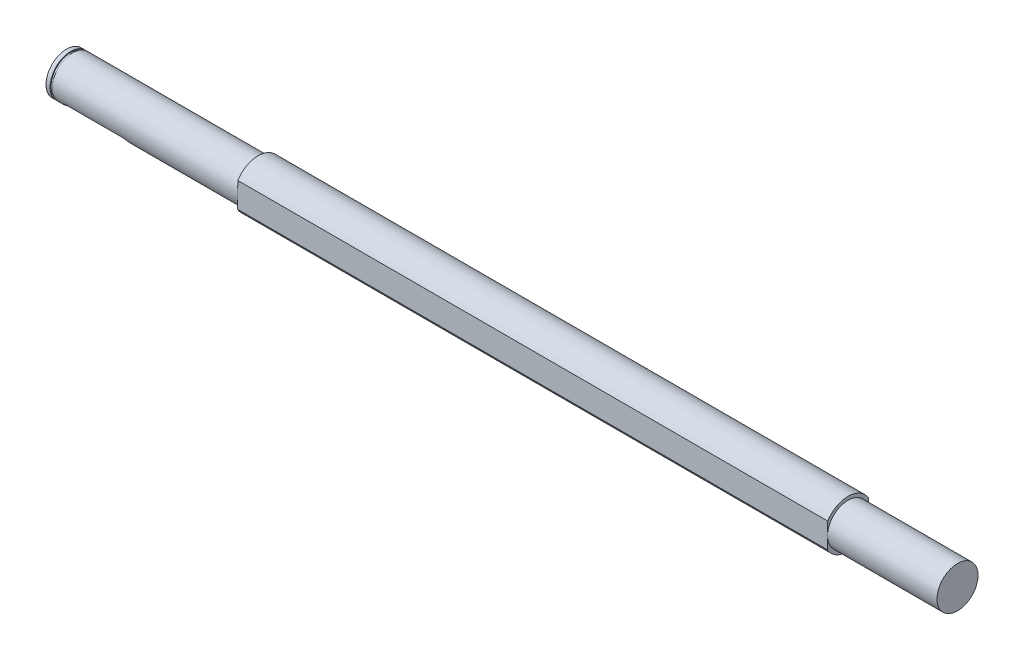
ISO-10303-21;
HEADER;
FILE_DESCRIPTION(('STEP AP214'),'2;1');
FILE_NAME('part.step','',(''),(''),'','','');
FILE_SCHEMA(('AUTOMOTIVE_DESIGN { 1 0 10303 214 1 1 1 1 }'));
ENDSEC;
DATA;
#1=APPLICATION_CONTEXT('core data for automotive mechanical design processes');
#2=APPLICATION_PROTOCOL_DEFINITION('international standard','automotive_design',2000,#1);
#3=PRODUCT_CONTEXT('',#1,'mechanical');
#4=PRODUCT('Part','Part','',(#3));
#5=PRODUCT_RELATED_PRODUCT_CATEGORY('part','',(#4));
#6=PRODUCT_DEFINITION_FORMATION('','',#4);
#7=PRODUCT_DEFINITION_CONTEXT('part definition',#1,'design');
#8=PRODUCT_DEFINITION('design','',#6,#7);
#9=PRODUCT_DEFINITION_SHAPE('','',#8);
#10=(LENGTH_UNIT() NAMED_UNIT(*) SI_UNIT(.MILLI.,.METRE.));
#11=(NAMED_UNIT(*) PLANE_ANGLE_UNIT() SI_UNIT($,.RADIAN.));
#12=(NAMED_UNIT(*) SI_UNIT($,.STERADIAN.) SOLID_ANGLE_UNIT());
#13=UNCERTAINTY_MEASURE_WITH_UNIT(LENGTH_MEASURE(1.E-05),#10,'distance_accuracy_value','');
#14=(GEOMETRIC_REPRESENTATION_CONTEXT(3) GLOBAL_UNCERTAINTY_ASSIGNED_CONTEXT((#13)) GLOBAL_UNIT_ASSIGNED_CONTEXT((#10,
#11,#12)) REPRESENTATION_CONTEXT('',''));
#15=CARTESIAN_POINT('',(0.,0.,0.));
#16=DIRECTION('',(0.,0.,1.));
#17=DIRECTION('',(1.,0.,0.));
#18=AXIS2_PLACEMENT_3D('',#15,#16,#17);
#19=CARTESIAN_POINT('',(-325.5,0.,0.));
#20=DIRECTION('',(-1.,0.,0.));
#21=DIRECTION('',(0.,0.,1.));
#22=AXIS2_PLACEMENT_3D('',#19,#20,#21);
#23=CYLINDRICAL_SURFACE('',#22,15.);
#24=CARTESIAN_POINT('',(-185.5,0.,0.));
#25=DIRECTION('',(-1.,0.,0.));
#26=DIRECTION('',(0.,0.,1.));
#27=AXIS2_PLACEMENT_3D('',#24,#25,#26);
#28=CIRCLE('',#27,15.);
#29=CARTESIAN_POINT('',(-185.5,0.25612963538557,14.997813094244));
#30=VERTEX_POINT('',#29);
#31=CARTESIAN_POINT('',(-185.5,0.25612963538557,-14.997813094244));
#32=VERTEX_POINT('',#31);
#33=EDGE_CURVE('E210',#30,#32,#28,.T.);
#34=ORIENTED_EDGE('',*,*,#33,.T.);
#35=EDGE_CURVE('E209',#32,#30,#28,.T.);
#36=ORIENTED_EDGE('',*,*,#35,.T.);
#37=EDGE_LOOP('',(#34,#36));
#38=FACE_BOUND('',#37,.T.);
#39=CARTESIAN_POINT('',(-320.9,0.,0.));
#40=DIRECTION('',(-1.,0.,0.));
#41=DIRECTION('',(0.,0.,1.));
#42=AXIS2_PLACEMENT_3D('',#39,#40,#41);
#43=CIRCLE('',#42,15.);
#44=CARTESIAN_POINT('',(-320.9,0.,15.));
#45=VERTEX_POINT('',#44);
#46=EDGE_CURVE('E139',#45,#45,#43,.T.);
#47=ORIENTED_EDGE('',*,*,#46,.F.);
#48=EDGE_LOOP('',(#47));
#49=FACE_BOUND('',#48,.T.);
#50=CARTESIAN_POINT('',(-272.5,-14.0474424568268,5.26016733784588));
#51=CARTESIAN_POINT('',(-272.363588172093,-14.0474377349199,5.26013820389123));
#52=CARTESIAN_POINT('',(-272.227185014359,-14.0453660462012,5.26571129083079));
#53=CARTESIAN_POINT('',(-271.955436759906,-14.0370558721608,5.28784636697262));
#54=CARTESIAN_POINT('',(-271.820091387547,-14.0308185116335,5.30440538979805));
#55=CARTESIAN_POINT('',(-271.551821342899,-14.0141687815497,5.34823221447327));
#56=CARTESIAN_POINT('',(-271.418890703097,-14.0037687936958,5.37546825272411));
#57=CARTESIAN_POINT('',(-271.155975354342,-13.9787292102991,5.4402520410106));
#58=CARTESIAN_POINT('',(-271.025990752042,-13.9640894615321,5.47780016372079));
#59=CARTESIAN_POINT('',(-270.76994100167,-13.9304965618603,5.56267403769161));
#60=CARTESIAN_POINT('',(-270.643872780107,-13.9115468957287,5.60999188682916));
#61=CARTESIAN_POINT('',(-270.39633145206,-13.869225116675,5.71381959138956));
#62=CARTESIAN_POINT('',(-270.274860080898,-13.84585135324,5.77033287627661));
#63=CARTESIAN_POINT('',(-269.918431071587,-13.7688967304051,5.95272426476689));
#64=CARTESIAN_POINT('',(-269.691349816361,-13.7084686528966,6.091490559605));
#65=CARTESIAN_POINT('',(-269.256362129662,-13.5659539007254,6.40274426922543));
#66=CARTESIAN_POINT('',(-269.049415751017,-13.4831778687844,6.57624927228739));
#67=CARTESIAN_POINT('',(-268.668979759463,-13.296036403093,6.94683036989116));
#68=CARTESIAN_POINT('',(-268.495496104132,-13.1916671318056,7.14391065158707));
#69=CARTESIAN_POINT('',(-268.182599665868,-12.9579049621404,7.55982738951223));
#70=CARTESIAN_POINT('',(-268.044194343739,-12.8279300298558,7.77909743740974));
#71=CARTESIAN_POINT('',(-267.812039475589,-12.5455840671215,8.22667597346589));
#72=CARTESIAN_POINT('',(-267.718276288113,-12.3932198968773,8.45498167744052));
#73=CARTESIAN_POINT('',(-267.581321179188,-12.0742625012808,8.90423492792477));
#74=CARTESIAN_POINT('',(-267.536483572902,-11.9083486029548,9.12516217571773));
#75=CARTESIAN_POINT('',(-267.493418571686,-11.5620760934703,9.56010380061229));
#76=CARTESIAN_POINT('',(-267.495180070612,-11.3817209343688,9.77411981272089));
#77=CARTESIAN_POINT('',(-267.544221351199,-11.0194803977554,10.1804859272811));
#78=CARTESIAN_POINT('',(-267.589712996873,-10.8379325276971,10.3733565867825));
#79=CARTESIAN_POINT('',(-267.721966186305,-10.4726172598045,10.7420517153407));
#80=CARTESIAN_POINT('',(-267.80873001845,-10.2888497394498,10.9178752385473));
#81=CARTESIAN_POINT('',(-268.02210613128,-9.92300286729053,11.2514961156681));
#82=CARTESIAN_POINT('',(-268.149227537907,-9.74097751366739,11.4090259478938));
#83=CARTESIAN_POINT('',(-268.43930244539,-9.3876237552169,11.701504412838));
#84=CARTESIAN_POINT('',(-268.602265693331,-9.21629827649319,11.836446885377));
#85=CARTESIAN_POINT('',(-268.96834474013,-8.88313323701207,12.0886586503445));
#86=CARTESIAN_POINT('',(-269.172987637847,-8.72211788456879,12.2047993195582));
#87=CARTESIAN_POINT('',(-269.612247541709,-8.425949041208,12.4111264371431));
#88=CARTESIAN_POINT('',(-269.846874193754,-8.29080390795374,12.5013045027313));
#89=CARTESIAN_POINT('',(-270.218391187969,-8.11189386195861,12.6175405672568));
#90=CARTESIAN_POINT('',(-270.346569255959,-8.05588486247114,12.65331605966));
#91=CARTESIAN_POINT('',(-270.608206226196,-7.95312629561886,12.7181553549193));
#92=CARTESIAN_POINT('',(-270.741662902595,-7.90637287432661,12.7472219521302));
#93=CARTESIAN_POINT('',(-271.012771358208,-7.82290422599136,12.7986161020993));
#94=CARTESIAN_POINT('',(-271.15041839138,-7.78617808004157,12.8209509879339));
#95=CARTESIAN_POINT('',(-271.428960193059,-7.72331750797088,12.8589155735559));
#96=CARTESIAN_POINT('',(-271.569853447452,-7.69717824550017,12.8745483352306));
#97=CARTESIAN_POINT('',(-271.842053058188,-7.65764861355719,12.8980978502647));
#98=CARTESIAN_POINT('',(-271.973186899473,-7.64338161661688,12.9065464508502));
#99=CARTESIAN_POINT('',(-272.236210415875,-7.6243341389232,12.9177997339071));
#100=CARTESIAN_POINT('',(-272.368098894585,-7.61954141701345,12.9206116992111));
#101=CARTESIAN_POINT('',(-272.5,-7.6195663599614,12.9206117690357));
#102=B_SPLINE_CURVE_WITH_KNOTS('',3,(#50,#51,#52,#53,#54,#55,#56,#57,#58,#59,#60,#61,#62,#63,
#64,#65,#66,#67,#68,#69,#70,#71,#72,#73,#74,#75,#76,#77,#78,#79,#80,#81,#82,#83,#84,#85,#86,#87,
#88,#89,#90,#91,#92,#93,#94,#95,#96,#97,#98,#99,#100,#101),.UNSPECIFIED.,.F.,.F.,(4,2,2,2,2,2,2,
2,2,2,2,2,2,2,2,2,2,2,2,2,2,2,2,2,2,4),(0.,0.409092423677147,0.818074430847269,1.22584885885817,
1.6336380256108,2.04109864022588,2.44871156823781,3.26359482908315,4.1072485115405,
4.95105225659396,5.81687991006165,6.68244281946299,7.51789679977676,8.35315166493873,
9.15564418669337,9.958181208819,10.771274204705,11.5845885928451,12.4361259663091,
13.2879379758687,13.7206337000479,14.1531488734623,14.5851911765747,15.0170358888757,
15.4131122811713,15.8086765909866),.UNSPECIFIED.);
#103=CARTESIAN_POINT('',(-272.5,-14.0474424568268,5.26016733784588));
#104=VERTEX_POINT('',#103);
#105=CARTESIAN_POINT('',(-272.5,-7.6195663599614,12.9206117690357));
#106=VERTEX_POINT('',#105);
#107=EDGE_CURVE('E218',#104,#106,#102,.T.);
#108=ORIENTED_EDGE('',*,*,#107,.F.);
#109=DIRECTION('',(-1.,0.,0.));
#110=VECTOR('',#109,1.);
#111=CARTESIAN_POINT('',(-325.5,-14.0474424568268,5.2601673378459));
#112=LINE('',#111,#110);
#113=CARTESIAN_POINT('',(-312.5,-14.0474424568268,5.26016733784589));
#114=VERTEX_POINT('',#113);
#115=EDGE_CURVE('E11',#114,#104,#112,.F.);
#116=ORIENTED_EDGE('',*,*,#115,.F.);
#117=CARTESIAN_POINT('',(-312.5,-7.6195663599614,12.9206117690357));
#118=CARTESIAN_POINT('',(-312.636411827907,-7.61953684866646,12.9206121779233));
#119=CARTESIAN_POINT('',(-312.772814985641,-7.62466552292207,12.9176042064203));
#120=CARTESIAN_POINT('',(-313.044563240094,-7.64502127094185,12.9055765669619));
#121=CARTESIAN_POINT('',(-313.179908612453,-7.66024561871361,12.8965585218187));
#122=CARTESIAN_POINT('',(-313.448178657101,-7.70051542015599,12.8725512903088));
#123=CARTESIAN_POINT('',(-313.581109296903,-7.72553174284816,12.8575798132299));
#124=CARTESIAN_POINT('',(-313.844024645658,-7.78498324179583,12.8216710505904));
#125=CARTESIAN_POINT('',(-313.974009247958,-7.81941875845698,12.8007335494191));
#126=CARTESIAN_POINT('',(-314.23005899833,-7.89716986176105,12.7529128078295));
#127=CARTESIAN_POINT('',(-314.356127219893,-7.94047827145643,12.7260343714323));
#128=CARTESIAN_POINT('',(-314.60366854794,-8.03537950007666,12.6663260636107));
#129=CARTESIAN_POINT('',(-314.725139919102,-8.0869754097559,12.6334939712282));
#130=CARTESIAN_POINT('',(-315.081568928413,-8.25323283320547,12.5260365297968));
#131=CARTESIAN_POINT('',(-315.308650183639,-8.37939773067957,12.4424299763466));
#132=CARTESIAN_POINT('',(-315.743637870338,-8.6611753700624,12.2480317040221));
#133=CARTESIAN_POINT('',(-315.950584248983,-8.81767053516315,12.1363843984052));
#134=CARTESIAN_POINT('',(-316.331020240537,-9.15012489871988,11.8877352998056));
#135=CARTESIAN_POINT('',(-316.504503895868,-9.32608755433637,11.7507290004949));
#136=CARTESIAN_POINT('',(-316.817400334132,-9.69509320768278,11.4482950198457));
#137=CARTESIAN_POINT('',(-316.955805656261,-9.88846214072199,11.2822188546003));
#138=CARTESIAN_POINT('',(-317.187960524411,-10.2802120912115,10.9264411643189));
#139=CARTESIAN_POINT('',(-317.281723711887,-10.478591558038,10.736746878735));
#140=CARTESIAN_POINT('',(-317.418678820812,-10.8656332716821,10.3446231544134));
#141=CARTESIAN_POINT('',(-317.463516427098,-11.0543934920663,10.1428662470333));
#142=CARTESIAN_POINT('',(-317.506581428314,-11.4225977861221,9.72632757448353));
#143=CARTESIAN_POINT('',(-317.504819929388,-11.6020440694046,9.51154892501044));
#144=CARTESIAN_POINT('',(-317.455778648801,-11.939334160525,9.08424690083927));
#145=CARTESIAN_POINT('',(-317.410287003127,-12.0977492245355,8.87196551231514));
#146=CARTESIAN_POINT('',(-317.278033813695,-12.397406715094,8.44817696701201));
#147=CARTESIAN_POINT('',(-317.19126998155,-12.5386481888858,8.23666985381901));
#148=CARTESIAN_POINT('',(-316.97789386872,-12.8036719725855,7.81844836035763));
#149=CARTESIAN_POINT('',(-316.850772462093,-12.9272002017463,7.61183361257059));
#150=CARTESIAN_POINT('',(-316.56069755461,-13.1538760253857,7.21305973924815));
#151=CARTESIAN_POINT('',(-316.397734306669,-13.2570180613845,7.02090456506627));
#152=CARTESIAN_POINT('',(-316.03165525987,-13.4475446609571,6.64900493777987));
#153=CARTESIAN_POINT('',(-315.827012362153,-13.5339608699106,6.47026815477774));
#154=CARTESIAN_POINT('',(-315.387752458291,-13.6857242350336,6.14277045366348));
#155=CARTESIAN_POINT('',(-315.153125806246,-13.7510645870663,5.99401922189791));
#156=CARTESIAN_POINT('',(-314.781608812031,-13.8344673611373,5.79764304072611));
#157=CARTESIAN_POINT('',(-314.653430744041,-13.8599734827298,5.73627259473143));
#158=CARTESIAN_POINT('',(-314.391793773804,-13.9059838855275,5.62381593594389));
#159=CARTESIAN_POINT('',(-314.258337097405,-13.9264902494074,5.57272544253877));
#160=CARTESIAN_POINT('',(-313.987228641792,-13.9626094280807,5.4816003700399));
#161=CARTESIAN_POINT('',(-313.84958160862,-13.9782275684963,5.44155376454674));
#162=CARTESIAN_POINT('',(-313.571039806941,-14.0046997629696,5.3730557047036));
#163=CARTESIAN_POINT('',(-313.430146552548,-14.0155559925742,5.34459895578771));
#164=CARTESIAN_POINT('',(-313.157946941812,-14.0318834890087,5.30158053740594));
#165=CARTESIAN_POINT('',(-313.026813100527,-14.037726298348,5.28606320411141));
#166=CARTESIAN_POINT('',(-312.763789584125,-14.0455010589586,5.26535098830773));
#167=CARTESIAN_POINT('',(-312.631901105415,-14.0474380567655,5.26014278596228));
#168=CARTESIAN_POINT('',(-312.5,-14.0474424568268,5.26016733784589));
#169=B_SPLINE_CURVE_WITH_KNOTS('',3,(#117,#118,#119,#120,#121,#122,#123,#124,#125,#126,#127,
#128,#129,#130,#131,#132,#133,#134,#135,#136,#137,#138,#139,#140,#141,#142,#143,#144,#145,#146,
#147,#148,#149,#150,#151,#152,#153,#154,#155,#156,#157,#158,#159,#160,#161,#162,#163,#164,#165,
#166,#167,#168),.UNSPECIFIED.,.F.,.F.,(4,2,2,2,2,2,2,2,2,2,2,2,2,2,2,2,2,2,2,2,2,2,2,2,2,4),(0.,
0.409092423677147,0.818074430847326,1.22584885885817,1.6336380256108,2.04109864022582,
2.44871156823775,3.26359482908315,4.10724851154048,4.95105225659396,5.81687991006164,
6.68244281946293,7.51789679977672,8.35315166493871,9.15564418669334,9.95818120881898,
10.771274204705,11.584588592845,12.4361259663091,13.2879379758687,13.7206337000479,
14.1531488734624,14.5851911765746,15.0170358888757,15.4131122811712,15.8086765909866),.UNSPECIFIED.);
#170=CARTESIAN_POINT('',(-312.5,-7.6195663599614,12.9206117690357));
#171=VERTEX_POINT('',#170);
#172=EDGE_CURVE('E47',#171,#114,#169,.T.);
#173=ORIENTED_EDGE('',*,*,#172,.F.);
#174=DIRECTION('',(-1.,0.,0.));
#175=VECTOR('',#174,1.);
#176=CARTESIAN_POINT('',(-325.5,-7.6195663599614,12.9206117690357));
#177=LINE('',#176,#175);
#178=EDGE_CURVE('E137',#106,#171,#177,.T.);
#179=ORIENTED_EDGE('',*,*,#178,.F.);
#180=EDGE_LOOP('',(#108,#116,#173,#179));
#181=FACE_BOUND('',#180,.T.);
#182=ADVANCED_FACE('F38',(#38,#49,#181),#23,.T.);
#183=CARTESIAN_POINT('',(-185.5,15.,0.));
#184=DIRECTION('',(1.,0.,0.));
#185=DIRECTION('',(0.,0.,-1.));
#186=AXIS2_PLACEMENT_3D('',#183,#184,#185);
#187=PLANE('',#186);
#188=CARTESIAN_POINT('',(-185.5,0.,0.));
#189=DIRECTION('',(-1.,0.,0.));
#190=DIRECTION('',(0.,0.,1.));
#191=AXIS2_PLACEMENT_3D('',#188,#189,#190);
#192=CIRCLE('',#191,17.5);
#193=CARTESIAN_POINT('',(-185.5,9.26869365723926,14.8438983386526));
#194=VERTEX_POINT('',#193);
#195=CARTESIAN_POINT('',(-185.5,9.26869365723926,-14.8438983386526));
#196=VERTEX_POINT('',#195);
#197=EDGE_CURVE('E205',#194,#196,#192,.T.);
#198=ORIENTED_EDGE('',*,*,#197,.T.);
#199=DIRECTION('',(0.,0.999854206282934,0.0170753090257047));
#200=VECTOR('',#199,1.);
#201=CARTESIAN_POINT('',(-185.5,9.26869365723926,-14.8438983386526));
#202=LINE('',#201,#200);
#203=EDGE_CURVE('E167',#32,#196,#202,.T.);
#204=ORIENTED_EDGE('',*,*,#203,.F.);
#205=ORIENTED_EDGE('',*,*,#33,.F.);
#206=DIRECTION('',(0.,-0.999854206282934,0.0170753090257047));
#207=VECTOR('',#206,1.);
#208=CARTESIAN_POINT('',(-185.5,9.26869365723926,14.8438983386526));
#209=LINE('',#208,#207);
#210=EDGE_CURVE('E179',#194,#30,#209,.T.);
#211=ORIENTED_EDGE('',*,*,#210,.F.);
#212=EDGE_LOOP('',(#198,#204,#205,#211));
#213=FACE_BOUND('',#212,.T.);
#214=ADVANCED_FACE('F280',(#213),#187,.F.);
#215=CARTESIAN_POINT('',(-325.5,0.,0.));
#216=DIRECTION('',(-1.,0.,0.));
#217=DIRECTION('',(0.,0.,1.));
#218=AXIS2_PLACEMENT_3D('',#215,#216,#217);
#219=CYLINDRICAL_SURFACE('',#218,17.5);
#220=CARTESIAN_POINT('',(245.5,0.,0.));
#221=DIRECTION('',(-1.,0.,0.));
#222=DIRECTION('',(0.,0.,1.));
#223=AXIS2_PLACEMENT_3D('',#220,#221,#222);
#224=CIRCLE('',#223,17.5);
#225=CARTESIAN_POINT('',(245.5,9.26869365723933,14.8438983386526));
#226=VERTEX_POINT('',#225);
#227=CARTESIAN_POINT('',(245.5,9.26869365723927,-14.8438983386526));
#228=VERTEX_POINT('',#227);
#229=EDGE_CURVE('E200',#226,#228,#224,.T.);
#230=ORIENTED_EDGE('',*,*,#229,.T.);
#231=DIRECTION('',(-1.,0.,0.));
#232=VECTOR('',#231,1.);
#233=CARTESIAN_POINT('',(263.719772694176,9.26869365723933,-14.8438983386526));
#234=LINE('',#233,#232);
#235=EDGE_CURVE('E168',#228,#196,#234,.T.);
#236=ORIENTED_EDGE('',*,*,#235,.T.);
#237=ORIENTED_EDGE('',*,*,#197,.F.);
#238=DIRECTION('',(-1.,0.,0.));
#239=VECTOR('',#238,1.);
#240=CARTESIAN_POINT('',(263.719772694176,9.26869365723933,14.8438983386526));
#241=LINE('',#240,#239);
#242=EDGE_CURVE('E182',#226,#194,#241,.T.);
#243=ORIENTED_EDGE('',*,*,#242,.F.);
#244=EDGE_LOOP('',(#230,#236,#237,#243));
#245=FACE_BOUND('',#244,.T.);
#246=ADVANCED_FACE('F284',(#245),#219,.T.);
#247=CARTESIAN_POINT('',(245.5,17.5,0.));
#248=DIRECTION('',(-1.,0.,0.));
#249=DIRECTION('',(0.,0.,1.));
#250=AXIS2_PLACEMENT_3D('',#247,#248,#249);
#251=PLANE('',#250);
#252=CARTESIAN_POINT('',(245.5,-8.75643438646803,-15.1517278498354));
#253=VERTEX_POINT('',#252);
#254=CARTESIAN_POINT('',(245.5,-8.75643438646813,15.1517278498354));
#255=VERTEX_POINT('',#254);
#256=EDGE_CURVE('E199',#253,#255,#224,.T.);
#257=ORIENTED_EDGE('',*,*,#256,.F.);
#258=DIRECTION('',(0.,-0.999854206282935,-0.0170753090257047));
#259=VECTOR('',#258,1.);
#260=CARTESIAN_POINT('',(245.5,9.26869365723933,-14.8438983386526));
#261=LINE('',#260,#259);
#262=CARTESIAN_POINT('',(245.5,0.25612963538557,-14.997813094244));
#263=VERTEX_POINT('',#262);
#264=EDGE_CURVE('E172',#263,#253,#261,.T.);
#265=ORIENTED_EDGE('',*,*,#264,.F.);
#266=CARTESIAN_POINT('',(245.5,0.,0.));
#267=DIRECTION('',(-1.,0.,0.));
#268=DIRECTION('',(0.,0.,1.));
#269=AXIS2_PLACEMENT_3D('',#266,#267,#268);
#270=CIRCLE('',#269,15.);
#271=CARTESIAN_POINT('',(245.5,0.25612963538557,14.997813094244));
#272=VERTEX_POINT('',#271);
#273=EDGE_CURVE('E194',#263,#272,#270,.T.);
#274=ORIENTED_EDGE('',*,*,#273,.T.);
#275=DIRECTION('',(0.,0.999854206282935,-0.0170753090257047));
#276=VECTOR('',#275,1.);
#277=CARTESIAN_POINT('',(245.5,9.26869365723933,14.8438983386526));
#278=LINE('',#277,#276);
#279=EDGE_CURVE('E188',#255,#272,#278,.T.);
#280=ORIENTED_EDGE('',*,*,#279,.F.);
#281=EDGE_LOOP('',(#257,#265,#274,#280));
#282=FACE_BOUND('',#281,.T.);
#283=ADVANCED_FACE('F297',(#282),#251,.F.);
#284=ORIENTED_EDGE('',*,*,#35,.F.);
#285=CARTESIAN_POINT('',(-185.5,-8.75643438646803,-15.1517278498354));
#286=VERTEX_POINT('',#285);
#287=EDGE_CURVE('E163',#286,#32,#202,.T.);
#288=ORIENTED_EDGE('',*,*,#287,.F.);
#289=CARTESIAN_POINT('',(-185.5,-8.75643438646803,15.1517278498354));
#290=VERTEX_POINT('',#289);
#291=EDGE_CURVE('E204',#286,#290,#192,.T.);
#292=ORIENTED_EDGE('',*,*,#291,.T.);
#293=EDGE_CURVE('E162',#30,#290,#209,.T.);
#294=ORIENTED_EDGE('',*,*,#293,.F.);
#295=EDGE_LOOP('',(#284,#288,#292,#294));
#296=FACE_BOUND('',#295,.T.);
#297=ADVANCED_FACE('F274',(#296),#187,.F.);
#298=ORIENTED_EDGE('',*,*,#291,.F.);
#299=DIRECTION('',(-1.,0.,0.));
#300=VECTOR('',#299,1.);
#301=CARTESIAN_POINT('',(263.719772694176,-8.75643438646797,-15.1517278498354));
#302=LINE('',#301,#300);
#303=EDGE_CURVE('E166',#253,#286,#302,.T.);
#304=ORIENTED_EDGE('',*,*,#303,.F.);
#305=ORIENTED_EDGE('',*,*,#256,.T.);
#306=DIRECTION('',(-1.,0.,0.));
#307=VECTOR('',#306,1.);
#308=CARTESIAN_POINT('',(263.719772694176,-8.75643438646797,15.1517278498354));
#309=LINE('',#308,#307);
#310=EDGE_CURVE('E61',#255,#290,#309,.T.);
#311=ORIENTED_EDGE('',*,*,#310,.T.);
#312=EDGE_LOOP('',(#298,#304,#305,#311));
#313=FACE_BOUND('',#312,.T.);
#314=ADVANCED_FACE('F270',(#313),#219,.T.);
#315=EDGE_CURVE('E195',#272,#263,#270,.T.);
#316=ORIENTED_EDGE('',*,*,#315,.T.);
#317=EDGE_CURVE('E175',#228,#263,#261,.T.);
#318=ORIENTED_EDGE('',*,*,#317,.F.);
#319=ORIENTED_EDGE('',*,*,#229,.F.);
#320=EDGE_CURVE('E185',#272,#226,#278,.T.);
#321=ORIENTED_EDGE('',*,*,#320,.F.);
#322=EDGE_LOOP('',(#316,#318,#319,#321));
#323=FACE_BOUND('',#322,.T.);
#324=ADVANCED_FACE('F289',(#323),#251,.F.);
#325=CARTESIAN_POINT('',(-325.5,0.,0.));
#326=DIRECTION('',(-1.,0.,0.));
#327=DIRECTION('',(0.,0.,1.));
#328=AXIS2_PLACEMENT_3D('',#325,#326,#327);
#329=CYLINDRICAL_SURFACE('',#328,15.);
#330=ORIENTED_EDGE('',*,*,#315,.F.);
#331=ORIENTED_EDGE('',*,*,#273,.F.);
#332=EDGE_LOOP('',(#330,#331));
#333=FACE_BOUND('',#332,.T.);
#334=CARTESIAN_POINT('',(325.5,0.,0.));
#335=DIRECTION('',(-1.,0.,0.));
#336=DIRECTION('',(0.,0.,1.));
#337=AXIS2_PLACEMENT_3D('',#334,#335,#336);
#338=CIRCLE('',#337,15.);
#339=CARTESIAN_POINT('',(325.5,0.,15.));
#340=VERTEX_POINT('',#339);
#341=EDGE_CURVE('E178',#340,#340,#338,.T.);
#342=ORIENTED_EDGE('',*,*,#341,.T.);
#343=EDGE_LOOP('',(#342));
#344=FACE_BOUND('',#343,.T.);
#345=ADVANCED_FACE('F294',(#333,#344),#329,.T.);
#346=CARTESIAN_POINT('',(325.5,15.,0.));
#347=DIRECTION('',(-1.,0.,0.));
#348=DIRECTION('',(0.,0.,1.));
#349=AXIS2_PLACEMENT_3D('',#346,#347,#348);
#350=PLANE('',#349);
#351=ORIENTED_EDGE('',*,*,#341,.F.);
#352=EDGE_LOOP('',(#351));
#353=FACE_BOUND('',#352,.T.);
#354=ADVANCED_FACE('F338',(#353),#350,.F.);
#355=CARTESIAN_POINT('',(263.719772694176,9.26869365723933,14.8438983386526));
#356=DIRECTION('',(0.,-0.0170753090257047,-0.999854206282934));
#357=DIRECTION('',(0.,0.999854206282935,-0.0170753090257047));
#358=AXIS2_PLACEMENT_3D('',#355,#356,#357);
#359=PLANE('',#358);
#360=ORIENTED_EDGE('',*,*,#279,.T.);
#361=ORIENTED_EDGE('',*,*,#320,.T.);
#362=ORIENTED_EDGE('',*,*,#242,.T.);
#363=ORIENTED_EDGE('',*,*,#210,.T.);
#364=ORIENTED_EDGE('',*,*,#293,.T.);
#365=ORIENTED_EDGE('',*,*,#310,.F.);
#366=EDGE_LOOP('',(#360,#361,#362,#363,#364,#365));
#367=FACE_BOUND('',#366,.T.);
#368=ADVANCED_FACE('F264',(#367),#359,.F.);
#369=CARTESIAN_POINT('',(263.719772694176,9.26869365723933,-14.8438983386526));
#370=DIRECTION('',(0.,-0.0170753090257047,0.999854206282934));
#371=DIRECTION('',(0.,-0.999854206282935,-0.0170753090257047));
#372=AXIS2_PLACEMENT_3D('',#369,#370,#371);
#373=PLANE('',#372);
#374=ORIENTED_EDGE('',*,*,#317,.T.);
#375=ORIENTED_EDGE('',*,*,#264,.T.);
#376=ORIENTED_EDGE('',*,*,#303,.T.);
#377=ORIENTED_EDGE('',*,*,#287,.T.);
#378=ORIENTED_EDGE('',*,*,#203,.T.);
#379=ORIENTED_EDGE('',*,*,#235,.F.);
#380=EDGE_LOOP('',(#374,#375,#376,#377,#378,#379));
#381=FACE_BOUND('',#380,.T.);
#382=ADVANCED_FACE('F277',(#381),#373,.F.);
#383=CARTESIAN_POINT('',(-322.5,0.,-15.));
#384=DIRECTION('',(1.,0.,0.));
#385=DIRECTION('',(0.,0.,-1.));
#386=AXIS2_PLACEMENT_3D('',#383,#384,#385);
#387=PLANE('',#386);
#388=CARTESIAN_POINT('',(-322.5,0.,0.));
#389=DIRECTION('',(-1.,0.,0.));
#390=DIRECTION('',(0.,0.,1.));
#391=AXIS2_PLACEMENT_3D('',#388,#389,#390);
#392=CIRCLE('',#391,14.3);
#393=CARTESIAN_POINT('',(-322.5,0.,14.3));
#394=VERTEX_POINT('',#393);
#395=EDGE_CURVE('E154',#394,#394,#392,.T.);
#396=ORIENTED_EDGE('',*,*,#395,.T.);
#397=EDGE_LOOP('',(#396));
#398=FACE_BOUND('',#397,.T.);
#399=CARTESIAN_POINT('',(-322.5,0.,0.));
#400=DIRECTION('',(-1.,0.,0.));
#401=DIRECTION('',(0.,0.,1.));
#402=AXIS2_PLACEMENT_3D('',#399,#400,#401);
#403=CIRCLE('',#402,15.);
#404=CARTESIAN_POINT('',(-322.5,0.,15.));
#405=VERTEX_POINT('',#404);
#406=EDGE_CURVE('E158',#405,#405,#403,.T.);
#407=ORIENTED_EDGE('',*,*,#406,.F.);
#408=EDGE_LOOP('',(#407));
#409=FACE_BOUND('',#408,.T.);
#410=ADVANCED_FACE('F324',(#398,#409),#387,.T.);
#411=CARTESIAN_POINT('',(-325.5,0.,0.));
#412=DIRECTION('',(-1.,0.,0.));
#413=DIRECTION('',(0.,0.,1.));
#414=AXIS2_PLACEMENT_3D('',#411,#412,#413);
#415=CYLINDRICAL_SURFACE('',#414,14.3);
#416=CARTESIAN_POINT('',(-320.9,0.,0.));
#417=DIRECTION('',(-1.,0.,0.));
#418=DIRECTION('',(0.,0.,1.));
#419=AXIS2_PLACEMENT_3D('',#416,#417,#418);
#420=CIRCLE('',#419,14.3);
#421=CARTESIAN_POINT('',(-320.9,0.,14.3));
#422=VERTEX_POINT('',#421);
#423=EDGE_CURVE('E145',#422,#422,#420,.T.);
#424=ORIENTED_EDGE('',*,*,#423,.T.);
#425=EDGE_LOOP('',(#424));
#426=FACE_BOUND('',#425,.T.);
#427=ORIENTED_EDGE('',*,*,#395,.F.);
#428=EDGE_LOOP('',(#427));
#429=FACE_BOUND('',#428,.T.);
#430=ADVANCED_FACE('F326',(#426,#429),#415,.T.);
#431=CARTESIAN_POINT('',(-320.9,0.,-15.));
#432=DIRECTION('',(-1.,0.,0.));
#433=DIRECTION('',(0.,0.,1.));
#434=AXIS2_PLACEMENT_3D('',#431,#432,#433);
#435=PLANE('',#434);
#436=ORIENTED_EDGE('',*,*,#46,.T.);
#437=EDGE_LOOP('',(#436));
#438=FACE_BOUND('',#437,.T.);
#439=ORIENTED_EDGE('',*,*,#423,.F.);
#440=EDGE_LOOP('',(#439));
#441=FACE_BOUND('',#440,.T.);
#442=ADVANCED_FACE('F242',(#438,#441),#435,.T.);
#443=CARTESIAN_POINT('',(-325.5,0.,0.));
#444=DIRECTION('',(1.,0.,0.));
#445=DIRECTION('',(0.,0.,-1.));
#446=AXIS2_PLACEMENT_3D('',#443,#444,#445);
#447=PLANE('',#446);
#448=CARTESIAN_POINT('',(-325.5,0.,0.));
#449=DIRECTION('',(-1.,0.,0.));
#450=DIRECTION('',(0.,0.,1.));
#451=AXIS2_PLACEMENT_3D('',#448,#449,#450);
#452=CIRCLE('',#451,15.);
#453=CARTESIAN_POINT('',(-325.5,0.,15.));
#454=VERTEX_POINT('',#453);
#455=EDGE_CURVE('E214',#454,#454,#452,.T.);
#456=ORIENTED_EDGE('',*,*,#455,.T.);
#457=EDGE_LOOP('',(#456));
#458=FACE_BOUND('',#457,.T.);
#459=ADVANCED_FACE('F40',(#458),#447,.F.);
#460=ORIENTED_EDGE('',*,*,#455,.F.);
#461=EDGE_LOOP('',(#460));
#462=FACE_BOUND('',#461,.T.);
#463=ORIENTED_EDGE('',*,*,#406,.T.);
#464=EDGE_LOOP('',(#463));
#465=FACE_BOUND('',#464,.T.);
#466=ADVANCED_FACE('F226',(#462,#465),#23,.T.);
#467=CARTESIAN_POINT('',(-312.5,-7.66044443118981,6.42787609686534));
#468=DIRECTION('',(0.,-0.766044443118982,0.642787609686535));
#469=DIRECTION('',(0.,-0.642787609686535,-0.766044443118982));
#470=AXIS2_PLACEMENT_3D('',#467,#468,#469);
#471=CYLINDRICAL_SURFACE('',#470,5.);
#472=DIRECTION('',(0.,-0.766044443118982,0.642787609686535));
#473=VECTOR('',#472,1.);
#474=CARTESIAN_POINT('',(-312.5,-4.44650638275714,10.2580983124603));
#475=LINE('',#474,#473);
#476=CARTESIAN_POINT('',(-312.5,-4.44650638275714,10.2580983124603));
#477=VERTEX_POINT('',#476);
#478=EDGE_CURVE('E131',#477,#171,#475,.T.);
#479=ORIENTED_EDGE('',*,*,#478,.T.);
#480=ORIENTED_EDGE('',*,*,#172,.T.);
#481=DIRECTION('',(0.,-0.766044443118982,0.642787609686535));
#482=VECTOR('',#481,1.);
#483=CARTESIAN_POINT('',(-312.5,-10.8743824796225,2.59765388127043));
#484=LINE('',#483,#482);
#485=CARTESIAN_POINT('',(-312.5,-10.8743824796225,2.59765388127043));
#486=VERTEX_POINT('',#485);
#487=EDGE_CURVE('E53',#486,#114,#484,.T.);
#488=ORIENTED_EDGE('',*,*,#487,.F.);
#489=CARTESIAN_POINT('',(-312.5,-7.66044443118981,6.42787609686534));
#490=DIRECTION('',(0.,0.766044443118982,-0.642787609686535));
#491=DIRECTION('',(0.,0.642787609686535,0.766044443118982));
#492=AXIS2_PLACEMENT_3D('',#489,#490,#491);
#493=CIRCLE('',#492,5.);
#494=EDGE_CURVE('E120',#486,#477,#493,.T.);
#495=ORIENTED_EDGE('',*,*,#494,.T.);
#496=EDGE_LOOP('',(#479,#480,#488,#495));
#497=FACE_BOUND('',#496,.T.);
#498=ADVANCED_FACE('F130',(#497),#471,.F.);
#499=CARTESIAN_POINT('',(-312.5,-4.44650638275714,10.2580983124603));
#500=DIRECTION('',(0.,-0.642787609686535,-0.766044443118982));
#501=DIRECTION('',(0.,0.766044443118982,-0.642787609686535));
#502=AXIS2_PLACEMENT_3D('',#499,#500,#501);
#503=PLANE('',#502);
#504=ORIENTED_EDGE('',*,*,#178,.T.);
#505=ORIENTED_EDGE('',*,*,#478,.F.);
#506=DIRECTION('',(1.,0.,0.));
#507=VECTOR('',#506,1.);
#508=CARTESIAN_POINT('',(-312.5,-4.44650638275714,10.2580983124603));
#509=LINE('',#508,#507);
#510=CARTESIAN_POINT('',(-272.5,-4.44650638275713,10.2580983124603));
#511=VERTEX_POINT('',#510);
#512=EDGE_CURVE('E116',#477,#511,#509,.T.);
#513=ORIENTED_EDGE('',*,*,#512,.T.);
#514=DIRECTION('',(0.,-0.766044443118982,0.642787609686535));
#515=VECTOR('',#514,1.);
#516=CARTESIAN_POINT('',(-272.5,-4.44650638275713,10.2580983124603));
#517=LINE('',#516,#515);
#518=EDGE_CURVE('E140',#511,#106,#517,.T.);
#519=ORIENTED_EDGE('',*,*,#518,.T.);
#520=EDGE_LOOP('',(#504,#505,#513,#519));
#521=FACE_BOUND('',#520,.T.);
#522=ADVANCED_FACE('F135',(#521),#503,.T.);
#523=CARTESIAN_POINT('',(-272.5,-7.66044443118981,6.42787609686534));
#524=DIRECTION('',(0.,-0.766044443118982,0.642787609686535));
#525=DIRECTION('',(0.,-0.642787609686535,-0.766044443118982));
#526=AXIS2_PLACEMENT_3D('',#523,#524,#525);
#527=CYLINDRICAL_SURFACE('',#526,5.00000000000001);
#528=DIRECTION('',(0.,-0.766044443118982,0.642787609686535));
#529=VECTOR('',#528,1.);
#530=CARTESIAN_POINT('',(-272.5,-10.8743824796225,2.59765388127042));
#531=LINE('',#530,#529);
#532=CARTESIAN_POINT('',(-272.5,-10.8743824796225,2.59765388127042));
#533=VERTEX_POINT('',#532);
#534=EDGE_CURVE('E147',#533,#104,#531,.T.);
#535=ORIENTED_EDGE('',*,*,#534,.T.);
#536=ORIENTED_EDGE('',*,*,#107,.T.);
#537=ORIENTED_EDGE('',*,*,#518,.F.);
#538=CARTESIAN_POINT('',(-272.5,-7.66044443118981,6.42787609686534));
#539=DIRECTION('',(0.,0.766044443118982,-0.642787609686535));
#540=DIRECTION('',(0.,0.642787609686535,0.766044443118982));
#541=AXIS2_PLACEMENT_3D('',#538,#539,#540);
#542=CIRCLE('',#541,5.00000000000001);
#543=EDGE_CURVE('E121',#511,#533,#542,.T.);
#544=ORIENTED_EDGE('',*,*,#543,.T.);
#545=EDGE_LOOP('',(#535,#536,#537,#544));
#546=FACE_BOUND('',#545,.T.);
#547=ADVANCED_FACE('F229',(#546),#527,.F.);
#548=CARTESIAN_POINT('',(-312.5,-10.8743824796225,2.59765388127043));
#549=DIRECTION('',(0.,0.642787609686535,0.766044443118982));
#550=DIRECTION('',(0.,-0.766044443118982,0.642787609686535));
#551=AXIS2_PLACEMENT_3D('',#548,#549,#550);
#552=PLANE('',#551);
#553=ORIENTED_EDGE('',*,*,#115,.T.);
#554=ORIENTED_EDGE('',*,*,#534,.F.);
#555=DIRECTION('',(-1.,0.,0.));
#556=VECTOR('',#555,1.);
#557=CARTESIAN_POINT('',(-312.5,-10.8743824796225,2.59765388127043));
#558=LINE('',#557,#556);
#559=EDGE_CURVE('E469',#533,#486,#558,.T.);
#560=ORIENTED_EDGE('',*,*,#559,.T.);
#561=ORIENTED_EDGE('',*,*,#487,.T.);
#562=EDGE_LOOP('',(#553,#554,#560,#561));
#563=FACE_BOUND('',#562,.T.);
#564=ADVANCED_FACE('F234',(#563),#552,.T.);
#565=CARTESIAN_POINT('',(-312.5,-7.66044443118981,6.42787609686534));
#566=DIRECTION('',(0.,0.766044443118982,-0.642787609686535));
#567=DIRECTION('',(0.,0.642787609686535,0.766044443118982));
#568=AXIS2_PLACEMENT_3D('',#565,#566,#567);
#569=PLANE('',#568);
#570=ORIENTED_EDGE('',*,*,#494,.F.);
#571=ORIENTED_EDGE('',*,*,#559,.F.);
#572=ORIENTED_EDGE('',*,*,#543,.F.);
#573=ORIENTED_EDGE('',*,*,#512,.F.);
#574=EDGE_LOOP('',(#570,#571,#572,#573));
#575=FACE_BOUND('',#574,.T.);
#576=ADVANCED_FACE('F118',(#575),#569,.F.);
#577=CLOSED_SHELL('',(#182,#214,#246,#283,#297,#314,#324,#345,#354,#368,#382,#410,#430,#442,
#459,#466,#498,#522,#547,#564,#576));
#578=MANIFOLD_SOLID_BREP('B2',#577);
#579=ADVANCED_BREP_SHAPE_REPRESENTATION('',(#18,#578),#14);
#580=SHAPE_DEFINITION_REPRESENTATION(#9,#579);
ENDSEC;
END-ISO-10303-21;
